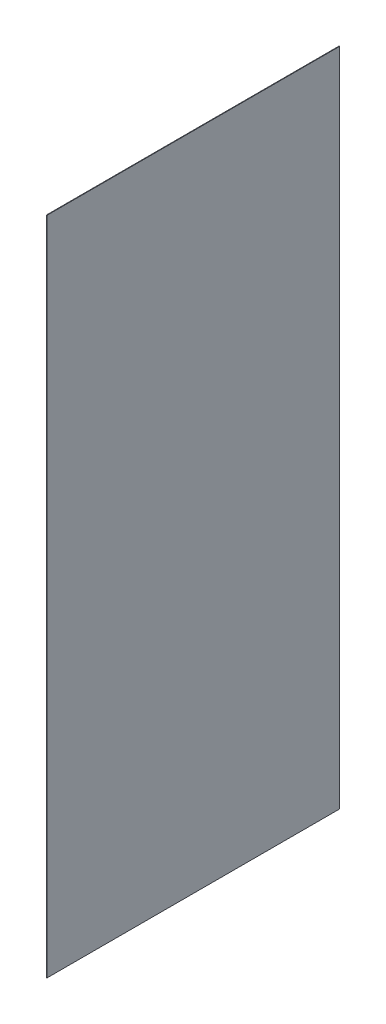
ISO-10303-21;
HEADER;
FILE_DESCRIPTION(('STEP AP214'),'2;1');
FILE_NAME('part.step','',(''),(''),'','','');
FILE_SCHEMA(('AUTOMOTIVE_DESIGN { 1 0 10303 214 1 1 1 1 }'));
ENDSEC;
DATA;
#1=APPLICATION_CONTEXT('core data for automotive mechanical design processes');
#2=APPLICATION_PROTOCOL_DEFINITION('international standard','automotive_design',2000,#1);
#3=PRODUCT_CONTEXT('',#1,'mechanical');
#4=PRODUCT('Part','Part','',(#3));
#5=PRODUCT_RELATED_PRODUCT_CATEGORY('part','',(#4));
#6=PRODUCT_DEFINITION_FORMATION('','',#4);
#7=PRODUCT_DEFINITION_CONTEXT('part definition',#1,'design');
#8=PRODUCT_DEFINITION('design','',#6,#7);
#9=PRODUCT_DEFINITION_SHAPE('','',#8);
#10=(LENGTH_UNIT() NAMED_UNIT(*) SI_UNIT(.MILLI.,.METRE.));
#11=(NAMED_UNIT(*) PLANE_ANGLE_UNIT() SI_UNIT($,.RADIAN.));
#12=(NAMED_UNIT(*) SI_UNIT($,.STERADIAN.) SOLID_ANGLE_UNIT());
#13=UNCERTAINTY_MEASURE_WITH_UNIT(LENGTH_MEASURE(1.E-05),#10,'distance_accuracy_value','');
#14=(GEOMETRIC_REPRESENTATION_CONTEXT(3) GLOBAL_UNCERTAINTY_ASSIGNED_CONTEXT((#13)) GLOBAL_UNIT_ASSIGNED_CONTEXT((#10,
#11,#12)) REPRESENTATION_CONTEXT('',''));
#15=CARTESIAN_POINT('',(0.,0.,0.));
#16=DIRECTION('',(0.,0.,1.));
#17=DIRECTION('',(1.,0.,0.));
#18=AXIS2_PLACEMENT_3D('',#15,#16,#17);
#19=CARTESIAN_POINT('',(698.5,120.,-820.));
#20=DIRECTION('',(-1.,0.,0.));
#21=DIRECTION('',(0.,0.,1.));
#22=AXIS2_PLACEMENT_3D('',#19,#20,#21);
#23=PLANE('',#22);
#24=DIRECTION('',(0.,-1.,0.));
#25=VECTOR('',#24,1.);
#26=CARTESIAN_POINT('',(698.5,120.,0.));
#27=LINE('',#26,#25);
#28=CARTESIAN_POINT('',(698.5,1970.,0.));
#29=VERTEX_POINT('',#28);
#30=CARTESIAN_POINT('',(698.5,120.,0.));
#31=VERTEX_POINT('',#30);
#32=EDGE_CURVE('E103',#29,#31,#27,.T.);
#33=ORIENTED_EDGE('',*,*,#32,.F.);
#34=DIRECTION('',(0.,0.,1.));
#35=VECTOR('',#34,1.);
#36=CARTESIAN_POINT('',(698.5,1970.,-820.));
#37=LINE('',#36,#35);
#38=CARTESIAN_POINT('',(698.5,1970.,-820.));
#39=VERTEX_POINT('',#38);
#40=EDGE_CURVE('E11',#39,#29,#37,.T.);
#41=ORIENTED_EDGE('',*,*,#40,.F.);
#42=DIRECTION('',(0.,-1.,0.));
#43=VECTOR('',#42,1.);
#44=CARTESIAN_POINT('',(698.5,120.,-820.));
#45=LINE('',#44,#43);
#46=CARTESIAN_POINT('',(698.5,120.,-820.));
#47=VERTEX_POINT('',#46);
#48=EDGE_CURVE('E97',#39,#47,#45,.T.);
#49=ORIENTED_EDGE('',*,*,#48,.T.);
#50=DIRECTION('',(0.,0.,1.));
#51=VECTOR('',#50,1.);
#52=CARTESIAN_POINT('',(698.5,120.,-820.));
#53=LINE('',#52,#51);
#54=EDGE_CURVE('E42',#47,#31,#53,.T.);
#55=ORIENTED_EDGE('',*,*,#54,.T.);
#56=EDGE_LOOP('',(#33,#41,#49,#55));
#57=FACE_BOUND('',#56,.T.);
#58=ADVANCED_FACE('F39',(#57),#23,.T.);
#59=CARTESIAN_POINT('',(698.5,1970.,-820.));
#60=DIRECTION('',(0.,1.,0.));
#61=DIRECTION('',(0.,0.,1.));
#62=AXIS2_PLACEMENT_3D('',#59,#60,#61);
#63=PLANE('',#62);
#64=DIRECTION('',(-1.,0.,0.));
#65=VECTOR('',#64,1.);
#66=CARTESIAN_POINT('',(698.5,1970.,0.));
#67=LINE('',#66,#65);
#68=CARTESIAN_POINT('',(700.,1970.,0.));
#69=VERTEX_POINT('',#68);
#70=EDGE_CURVE('E99',#69,#29,#67,.T.);
#71=ORIENTED_EDGE('',*,*,#70,.F.);
#72=DIRECTION('',(0.,0.,1.));
#73=VECTOR('',#72,1.);
#74=CARTESIAN_POINT('',(700.,1970.,-820.));
#75=LINE('',#74,#73);
#76=CARTESIAN_POINT('',(700.,1970.,-820.));
#77=VERTEX_POINT('',#76);
#78=EDGE_CURVE('E48',#77,#69,#75,.T.);
#79=ORIENTED_EDGE('',*,*,#78,.F.);
#80=DIRECTION('',(-1.,0.,0.));
#81=VECTOR('',#80,1.);
#82=CARTESIAN_POINT('',(698.5,1970.,-820.));
#83=LINE('',#82,#81);
#84=EDGE_CURVE('E94',#77,#39,#83,.T.);
#85=ORIENTED_EDGE('',*,*,#84,.T.);
#86=ORIENTED_EDGE('',*,*,#40,.T.);
#87=EDGE_LOOP('',(#71,#79,#85,#86));
#88=FACE_BOUND('',#87,.T.);
#89=ADVANCED_FACE('F113',(#88),#63,.T.);
#90=CARTESIAN_POINT('',(700.,120.,-820.));
#91=DIRECTION('',(1.,0.,0.));
#92=DIRECTION('',(0.,0.,-1.));
#93=AXIS2_PLACEMENT_3D('',#90,#91,#92);
#94=PLANE('',#93);
#95=DIRECTION('',(0.,1.,0.));
#96=VECTOR('',#95,1.);
#97=CARTESIAN_POINT('',(700.,120.,0.));
#98=LINE('',#97,#96);
#99=CARTESIAN_POINT('',(700.,120.,0.));
#100=VERTEX_POINT('',#99);
#101=EDGE_CURVE('E89',#100,#69,#98,.T.);
#102=ORIENTED_EDGE('',*,*,#101,.F.);
#103=DIRECTION('',(0.,0.,1.));
#104=VECTOR('',#103,1.);
#105=CARTESIAN_POINT('',(700.,120.,-820.));
#106=LINE('',#105,#104);
#107=CARTESIAN_POINT('',(700.,120.,-820.));
#108=VERTEX_POINT('',#107);
#109=EDGE_CURVE('E84',#108,#100,#106,.T.);
#110=ORIENTED_EDGE('',*,*,#109,.F.);
#111=DIRECTION('',(0.,1.,0.));
#112=VECTOR('',#111,1.);
#113=CARTESIAN_POINT('',(700.,120.,-820.));
#114=LINE('',#113,#112);
#115=EDGE_CURVE('E87',#108,#77,#114,.T.);
#116=ORIENTED_EDGE('',*,*,#115,.T.);
#117=ORIENTED_EDGE('',*,*,#78,.T.);
#118=EDGE_LOOP('',(#102,#110,#116,#117));
#119=FACE_BOUND('',#118,.T.);
#120=ADVANCED_FACE('F86',(#119),#94,.T.);
#121=CARTESIAN_POINT('',(698.5,120.,-820.));
#122=DIRECTION('',(0.,-1.,0.));
#123=DIRECTION('',(0.,0.,-1.));
#124=AXIS2_PLACEMENT_3D('',#121,#122,#123);
#125=PLANE('',#124);
#126=DIRECTION('',(1.,0.,0.));
#127=VECTOR('',#126,1.);
#128=CARTESIAN_POINT('',(698.5,120.,0.));
#129=LINE('',#128,#127);
#130=EDGE_CURVE('E106',#31,#100,#129,.T.);
#131=ORIENTED_EDGE('',*,*,#130,.F.);
#132=ORIENTED_EDGE('',*,*,#54,.F.);
#133=DIRECTION('',(1.,0.,0.));
#134=VECTOR('',#133,1.);
#135=CARTESIAN_POINT('',(698.5,120.,-820.));
#136=LINE('',#135,#134);
#137=EDGE_CURVE('E93',#47,#108,#136,.T.);
#138=ORIENTED_EDGE('',*,*,#137,.T.);
#139=ORIENTED_EDGE('',*,*,#109,.T.);
#140=EDGE_LOOP('',(#131,#132,#138,#139));
#141=FACE_BOUND('',#140,.T.);
#142=ADVANCED_FACE('F96',(#141),#125,.T.);
#143=CARTESIAN_POINT('',(0.,0.,-820.));
#144=DIRECTION('',(0.,0.,-1.));
#145=DIRECTION('',(-1.,0.,0.));
#146=AXIS2_PLACEMENT_3D('',#143,#144,#145);
#147=PLANE('',#146);
#148=ORIENTED_EDGE('',*,*,#48,.F.);
#149=ORIENTED_EDGE('',*,*,#84,.F.);
#150=ORIENTED_EDGE('',*,*,#115,.F.);
#151=ORIENTED_EDGE('',*,*,#137,.F.);
#152=EDGE_LOOP('',(#148,#149,#150,#151));
#153=FACE_BOUND('',#152,.T.);
#154=ADVANCED_FACE('F92',(#153),#147,.T.);
#155=CARTESIAN_POINT('',(0.,0.,0.));
#156=DIRECTION('',(0.,0.,-1.));
#157=DIRECTION('',(-1.,0.,0.));
#158=AXIS2_PLACEMENT_3D('',#155,#156,#157);
#159=PLANE('',#158);
#160=ORIENTED_EDGE('',*,*,#32,.T.);
#161=ORIENTED_EDGE('',*,*,#130,.T.);
#162=ORIENTED_EDGE('',*,*,#101,.T.);
#163=ORIENTED_EDGE('',*,*,#70,.T.);
#164=EDGE_LOOP('',(#160,#161,#162,#163));
#165=FACE_BOUND('',#164,.T.);
#166=ADVANCED_FACE('F112',(#165),#159,.F.);
#167=CLOSED_SHELL('',(#58,#89,#120,#142,#154,#166));
#168=MANIFOLD_SOLID_BREP('B2',#167);
#169=ADVANCED_BREP_SHAPE_REPRESENTATION('',(#18,#168),#14);
#170=SHAPE_DEFINITION_REPRESENTATION(#9,#169);
ENDSEC;
END-ISO-10303-21;
